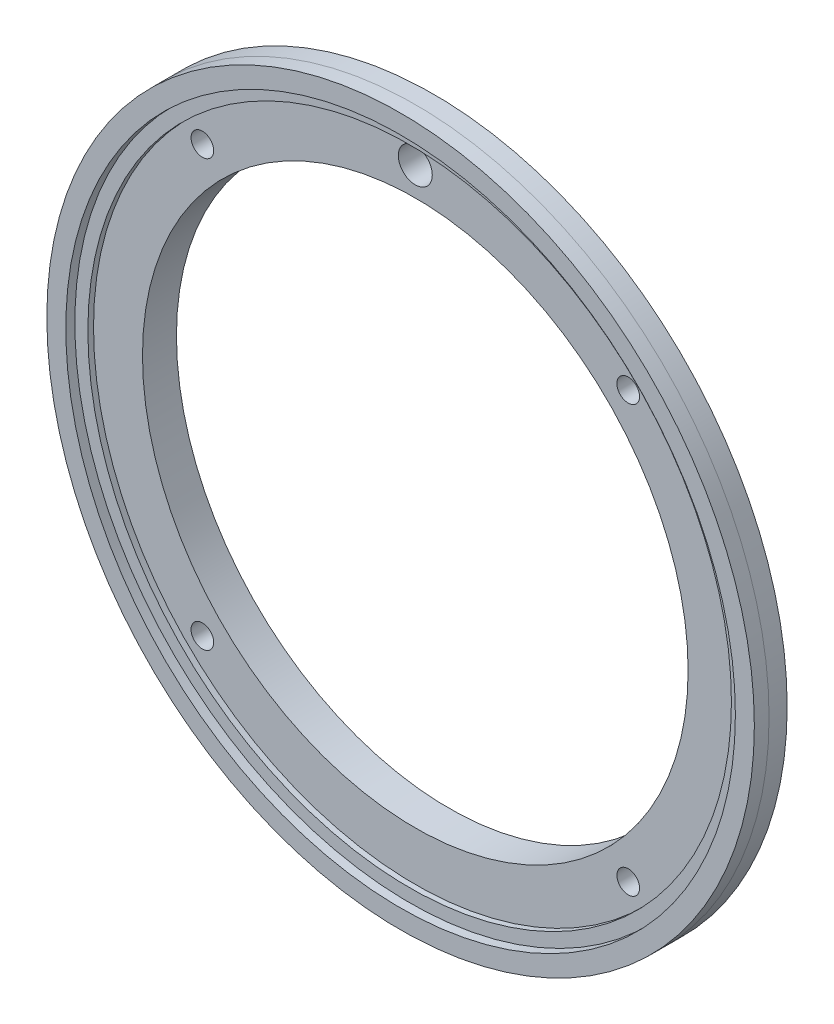
ISO-10303-21;
HEADER;
FILE_DESCRIPTION(('STEP AP214'),'2;1');
FILE_NAME('part.step','',(''),(''),'','','');
FILE_SCHEMA(('AUTOMOTIVE_DESIGN { 1 0 10303 214 1 1 1 1 }'));
ENDSEC;
DATA;
#1=APPLICATION_CONTEXT('core data for automotive mechanical design processes');
#2=APPLICATION_PROTOCOL_DEFINITION('international standard','automotive_design',2000,#1);
#3=PRODUCT_CONTEXT('',#1,'mechanical');
#4=PRODUCT('Part','Part','',(#3));
#5=PRODUCT_RELATED_PRODUCT_CATEGORY('part','',(#4));
#6=PRODUCT_DEFINITION_FORMATION('','',#4);
#7=PRODUCT_DEFINITION_CONTEXT('part definition',#1,'design');
#8=PRODUCT_DEFINITION('design','',#6,#7);
#9=PRODUCT_DEFINITION_SHAPE('','',#8);
#10=(LENGTH_UNIT() NAMED_UNIT(*) SI_UNIT(.MILLI.,.METRE.));
#11=(NAMED_UNIT(*) PLANE_ANGLE_UNIT() SI_UNIT($,.RADIAN.));
#12=(NAMED_UNIT(*) SI_UNIT($,.STERADIAN.) SOLID_ANGLE_UNIT());
#13=UNCERTAINTY_MEASURE_WITH_UNIT(LENGTH_MEASURE(1.E-05),#10,'distance_accuracy_value','');
#14=(GEOMETRIC_REPRESENTATION_CONTEXT(3) GLOBAL_UNCERTAINTY_ASSIGNED_CONTEXT((#13)) GLOBAL_UNIT_ASSIGNED_CONTEXT((#10,
#11,#12)) REPRESENTATION_CONTEXT('',''));
#15=CARTESIAN_POINT('',(0.,0.,0.));
#16=DIRECTION('',(0.,0.,1.));
#17=DIRECTION('',(1.,0.,0.));
#18=AXIS2_PLACEMENT_3D('',#15,#16,#17);
#19=CARTESIAN_POINT('',(28.425,0.,3.));
#20=DIRECTION('',(0.,0.,1.));
#21=DIRECTION('',(1.,0.,0.));
#22=AXIS2_PLACEMENT_3D('',#19,#20,#21);
#23=PLANE('',#22);
#24=CARTESIAN_POINT('',(0.,0.,3.));
#25=DIRECTION('',(0.,0.,1.));
#26=DIRECTION('',(1.,0.,0.));
#27=AXIS2_PLACEMENT_3D('',#24,#25,#26);
#28=CIRCLE('',#27,31.25);
#29=CARTESIAN_POINT('',(31.25,0.,3.));
#30=VERTEX_POINT('',#29);
#31=EDGE_CURVE('E49',#30,#30,#28,.T.);
#32=ORIENTED_EDGE('',*,*,#31,.T.);
#33=EDGE_LOOP('',(#32));
#34=FACE_BOUND('',#33,.T.);
#35=CARTESIAN_POINT('',(18.8090403795621,18.8090403795622,3.));
#36=DIRECTION('',(0.,0.,1.));
#37=DIRECTION('',(1.,0.,0.));
#38=AXIS2_PLACEMENT_3D('',#35,#36,#37);
#39=CIRCLE('',#38,1.00000000000013);
#40=CARTESIAN_POINT('',(17.809040379562,18.8090403795622,3.));
#41=VERTEX_POINT('',#40);
#42=EDGE_CURVE('E120',#41,#41,#39,.T.);
#43=ORIENTED_EDGE('',*,*,#42,.F.);
#44=EDGE_LOOP('',(#43));
#45=FACE_BOUND('',#44,.T.);
#46=CARTESIAN_POINT('',(18.8090403795622,-18.8090403795621,3.));
#47=DIRECTION('',(0.,0.,1.));
#48=DIRECTION('',(1.,0.,0.));
#49=AXIS2_PLACEMENT_3D('',#46,#47,#48);
#50=CIRCLE('',#49,1.00000000000009);
#51=CARTESIAN_POINT('',(17.8090403795621,-18.8090403795621,3.));
#52=VERTEX_POINT('',#51);
#53=EDGE_CURVE('E123',#52,#52,#50,.T.);
#54=ORIENTED_EDGE('',*,*,#53,.F.);
#55=EDGE_LOOP('',(#54));
#56=FACE_BOUND('',#55,.T.);
#57=CARTESIAN_POINT('',(-18.8090403795621,-18.8090403795622,3.));
#58=DIRECTION('',(0.,0.,1.));
#59=DIRECTION('',(1.,0.,0.));
#60=AXIS2_PLACEMENT_3D('',#57,#58,#59);
#61=CIRCLE('',#60,1.00000000000004);
#62=CARTESIAN_POINT('',(-19.8090403795622,-18.8090403795622,3.));
#63=VERTEX_POINT('',#62);
#64=EDGE_CURVE('E126',#63,#63,#61,.T.);
#65=ORIENTED_EDGE('',*,*,#64,.F.);
#66=EDGE_LOOP('',(#65));
#67=FACE_BOUND('',#66,.T.);
#68=CARTESIAN_POINT('',(0.,26.6,3.));
#69=DIRECTION('',(0.,0.,1.));
#70=DIRECTION('',(1.,0.,0.));
#71=AXIS2_PLACEMENT_3D('',#68,#69,#70);
#72=CIRCLE('',#71,1.5);
#73=CARTESIAN_POINT('',(1.5,26.6,3.));
#74=VERTEX_POINT('',#73);
#75=EDGE_CURVE('E129',#74,#74,#72,.T.);
#76=ORIENTED_EDGE('',*,*,#75,.F.);
#77=EDGE_LOOP('',(#76));
#78=FACE_BOUND('',#77,.T.);
#79=CARTESIAN_POINT('',(-18.8090403795622,18.8090403795621,3.));
#80=DIRECTION('',(0.,0.,1.));
#81=DIRECTION('',(1.,0.,0.));
#82=AXIS2_PLACEMENT_3D('',#79,#80,#81);
#83=CIRCLE('',#82,0.999999999999998);
#84=CARTESIAN_POINT('',(-19.8090403795622,18.8090403795621,3.));
#85=VERTEX_POINT('',#84);
#86=EDGE_CURVE('E132',#85,#85,#83,.T.);
#87=ORIENTED_EDGE('',*,*,#86,.F.);
#88=EDGE_LOOP('',(#87));
#89=FACE_BOUND('',#88,.T.);
#90=CARTESIAN_POINT('',(0.,0.,3.));
#91=DIRECTION('',(0.,0.,1.));
#92=DIRECTION('',(1.,0.,0.));
#93=AXIS2_PLACEMENT_3D('',#90,#91,#92);
#94=CIRCLE('',#93,24.1);
#95=CARTESIAN_POINT('',(24.1,0.,3.));
#96=VERTEX_POINT('',#95);
#97=EDGE_CURVE('E117',#96,#96,#94,.T.);
#98=ORIENTED_EDGE('',*,*,#97,.F.);
#99=EDGE_LOOP('',(#98));
#100=FACE_BOUND('',#99,.T.);
#101=ADVANCED_FACE('F45',(#34,#45,#56,#67,#78,#89,#100),#23,.T.);
#102=CARTESIAN_POINT('',(0.,0.,85.955757467538));
#103=DIRECTION('',(0.,0.,-1.));
#104=DIRECTION('',(-1.,0.,0.));
#105=AXIS2_PLACEMENT_3D('',#102,#103,#104);
#106=CYLINDRICAL_SURFACE('',#105,29.4);
#107=CARTESIAN_POINT('',(0.,0.,0.6));
#108=DIRECTION('',(0.,0.,1.));
#109=DIRECTION('',(1.,0.,0.));
#110=AXIS2_PLACEMENT_3D('',#107,#108,#109);
#111=CIRCLE('',#110,29.4);
#112=CARTESIAN_POINT('',(-29.4,0.,0.600000000000003));
#113=VERTEX_POINT('',#112);
#114=EDGE_CURVE('E109',#113,#113,#111,.T.);
#115=CARTESIAN_POINT('',(0.,0.,1.4));
#116=DIRECTION('',(0.,0.,1.));
#117=DIRECTION('',(1.,0.,0.));
#118=AXIS2_PLACEMENT_3D('',#115,#116,#117);
#119=CIRCLE('',#118,29.4);
#120=CARTESIAN_POINT('',(-29.4,0.,1.4));
#121=VERTEX_POINT('',#120);
#122=EDGE_CURVE('E105',#121,#121,#119,.T.);
#123=CARTESIAN_POINT('',(-29.4,0.,0.600000000000003));
#124=CARTESIAN_POINT('',(-29.4,0.,0.608333333333336));
#125=CARTESIAN_POINT('',(-29.4,0.,0.616666666666668));
#126=CARTESIAN_POINT('',(-29.4,0.,0.633333333333333));
#127=CARTESIAN_POINT('',(-29.4,0.,0.641666666666665));
#128=CARTESIAN_POINT('',(-29.4,0.,0.658333333333335));
#129=CARTESIAN_POINT('',(-29.4,0.,0.666666666666672));
#130=CARTESIAN_POINT('',(-29.4,0.,0.683333333333341));
#131=CARTESIAN_POINT('',(-29.4,0.,0.691666666666674));
#132=CARTESIAN_POINT('',(-29.4,0.,0.708333333333339));
#133=CARTESIAN_POINT('',(-29.4,0.,0.716666666666671));
#134=CARTESIAN_POINT('',(-29.4,0.,0.733333333333336));
#135=CARTESIAN_POINT('',(-29.4,0.,0.741666666666668));
#136=CARTESIAN_POINT('',(-29.4,0.,0.758333333333333));
#137=CARTESIAN_POINT('',(-29.4,0.,0.766666666666665));
#138=CARTESIAN_POINT('',(-29.4,0.,0.783333333333335));
#139=CARTESIAN_POINT('',(-29.4,0.,0.791666666666672));
#140=CARTESIAN_POINT('',(-29.4,0.,0.808333333333341));
#141=CARTESIAN_POINT('',(-29.4,0.,0.816666666666674));
#142=CARTESIAN_POINT('',(-29.4,0.,0.833333333333339));
#143=CARTESIAN_POINT('',(-29.4,0.,0.841666666666671));
#144=CARTESIAN_POINT('',(-29.4,0.,0.858333333333336));
#145=CARTESIAN_POINT('',(-29.4,0.,0.866666666666668));
#146=CARTESIAN_POINT('',(-29.4,0.,0.883333333333333));
#147=CARTESIAN_POINT('',(-29.4,0.,0.891666666666666));
#148=CARTESIAN_POINT('',(-29.4,0.,0.90833333333333));
#149=CARTESIAN_POINT('',(-29.4,0.,0.916666666666663));
#150=CARTESIAN_POINT('',(-29.4,0.,0.933333333333332));
#151=CARTESIAN_POINT('',(-29.4,0.,0.941666666666669));
#152=CARTESIAN_POINT('',(-29.4,0.,0.958333333333339));
#153=CARTESIAN_POINT('',(-29.4,0.,0.966666666666671));
#154=CARTESIAN_POINT('',(-29.4,0.,0.983333333333336));
#155=CARTESIAN_POINT('',(-29.4,0.,0.991666666666668));
#156=CARTESIAN_POINT('',(-29.4,0.,1.00833333333333));
#157=CARTESIAN_POINT('',(-29.4,0.,1.01666666666667));
#158=CARTESIAN_POINT('',(-29.4,0.,1.03333333333333));
#159=CARTESIAN_POINT('',(-29.4,0.,1.04166666666666));
#160=CARTESIAN_POINT('',(-29.4,0.,1.05833333333333));
#161=CARTESIAN_POINT('',(-29.4,0.,1.06666666666667));
#162=CARTESIAN_POINT('',(-29.4,0.,1.08333333333334));
#163=CARTESIAN_POINT('',(-29.4,0.,1.09166666666667));
#164=CARTESIAN_POINT('',(-29.4,0.,1.10833333333334));
#165=CARTESIAN_POINT('',(-29.4,0.,1.11666666666667));
#166=CARTESIAN_POINT('',(-29.4,0.,1.13333333333333));
#167=CARTESIAN_POINT('',(-29.4,0.,1.14166666666667));
#168=CARTESIAN_POINT('',(-29.4,0.,1.15833333333333));
#169=CARTESIAN_POINT('',(-29.4,0.,1.16666666666666));
#170=CARTESIAN_POINT('',(-29.4,0.,1.18333333333333));
#171=CARTESIAN_POINT('',(-29.4,0.,1.19166666666666));
#172=CARTESIAN_POINT('',(-29.4,0.,1.20833333333333));
#173=CARTESIAN_POINT('',(-29.4,0.,1.21666666666667));
#174=CARTESIAN_POINT('',(-29.4,0.,1.23333333333334));
#175=CARTESIAN_POINT('',(-29.4,0.,1.24166666666667));
#176=CARTESIAN_POINT('',(-29.4,0.,1.25833333333333));
#177=CARTESIAN_POINT('',(-29.4,0.,1.26666666666667));
#178=CARTESIAN_POINT('',(-29.4,0.,1.28333333333333));
#179=CARTESIAN_POINT('',(-29.4,0.,1.29166666666666));
#180=CARTESIAN_POINT('',(-29.4,0.,1.30833333333333));
#181=CARTESIAN_POINT('',(-29.4,0.,1.31666666666666));
#182=CARTESIAN_POINT('',(-29.4,0.,1.33333333333333));
#183=CARTESIAN_POINT('',(-29.4,0.,1.34166666666667));
#184=CARTESIAN_POINT('',(-29.4,0.,1.35833333333334));
#185=CARTESIAN_POINT('',(-29.4,0.,1.36666666666667));
#186=CARTESIAN_POINT('',(-29.4,0.,1.38333333333333));
#187=CARTESIAN_POINT('',(-29.4,0.,1.39166666666667));
#188=CARTESIAN_POINT('',(-29.4,0.,1.4));
#189=B_SPLINE_CURVE_WITH_KNOTS('',3,(#123,#124,#125,#126,#127,#128,#129,#130,#131,#132,#133,
#134,#135,#136,#137,#138,#139,#140,#141,#142,#143,#144,#145,#146,#147,#148,#149,#150,#151,#152,
#153,#154,#155,#156,#157,#158,#159,#160,#161,#162,#163,#164,#165,#166,#167,#168,#169,#170,#171,
#172,#173,#174,#175,#176,#177,#178,#179,#180,#181,#182,#183,#184,#185,#186,#187,#188),
.UNSPECIFIED.,.F.,.F.,(4,2,2,2,2,2,2,2,2,2,2,2,2,2,2,2,2,2,2,2,2,2,2,2,2,2,2,2,2,2,2,2,4),(0.,
0.0249999999999972,0.0499999999999945,0.0750000000000056,0.100000000000003,0.125,
0.149999999999997,0.174999999999995,0.200000000000006,0.225000000000003,0.25,0.274999999999997,
0.299999999999995,0.324999999999992,0.350000000000003,0.375,0.399999999999998,0.424999999999995,
0.449999999999992,0.475000000000003,0.5,0.524999999999998,0.549999999999995,0.574999999999992,
0.599999999999989,0.625000000000001,0.649999999999998,0.674999999999995,0.699999999999992,
0.72499999999999,0.750000000000001,0.774999999999998,0.799999999999995),.UNSPECIFIED.);
#190=EDGE_CURVE('BSEAM172',#113,#121,#189,.T.);
#191=ORIENTED_EDGE('',*,*,#114,.T.);
#192=ORIENTED_EDGE('',*,*,#122,.F.);
#193=ORIENTED_EDGE('',*,*,#190,.T.);
#194=ORIENTED_EDGE('',*,*,#190,.F.);
#195=EDGE_LOOP('',(#191,#193,#192,#194));
#196=FACE_BOUND('',#195,.T.);
#197=ADVANCED_FACE('F172',(#196),#106,.T.);
#198=CARTESIAN_POINT('',(0.,0.,0.6));
#199=DIRECTION('',(0.,0.,-1.));
#200=DIRECTION('',(-1.,0.,0.));
#201=AXIS2_PLACEMENT_3D('',#198,#199,#200);
#202=CYLINDRICAL_SURFACE('',#201,28.3);
#203=CARTESIAN_POINT('',(0.,0.,0.6));
#204=DIRECTION('',(0.,0.,1.));
#205=DIRECTION('',(1.,0.,0.));
#206=AXIS2_PLACEMENT_3D('',#203,#204,#205);
#207=CIRCLE('',#206,28.3);
#208=CARTESIAN_POINT('',(-1.5,28.2602193905143,0.6));
#209=VERTEX_POINT('',#208);
#210=CARTESIAN_POINT('',(1.5,28.2602193905143,0.6));
#211=VERTEX_POINT('',#210);
#212=EDGE_CURVE('E102',#209,#211,#207,.T.);
#213=ORIENTED_EDGE('',*,*,#212,.F.);
#214=DIRECTION('',(0.,0.,-1.));
#215=VECTOR('',#214,1.);
#216=CARTESIAN_POINT('',(-1.5,28.2602193905143,4.04818792991333));
#217=LINE('',#216,#215);
#218=CARTESIAN_POINT('',(-1.5,28.2602193905143,0.));
#219=VERTEX_POINT('',#218);
#220=EDGE_CURVE('E86',#209,#219,#217,.T.);
#221=ORIENTED_EDGE('',*,*,#220,.T.);
#222=CARTESIAN_POINT('',(0.,0.,0.));
#223=DIRECTION('',(0.,0.,1.));
#224=DIRECTION('',(1.,0.,0.));
#225=AXIS2_PLACEMENT_3D('',#222,#223,#224);
#226=CIRCLE('',#225,28.3);
#227=CARTESIAN_POINT('',(1.5,28.2602193905143,0.));
#228=VERTEX_POINT('',#227);
#229=EDGE_CURVE('E94',#219,#228,#226,.T.);
#230=ORIENTED_EDGE('',*,*,#229,.T.);
#231=DIRECTION('',(0.,0.,-1.));
#232=VECTOR('',#231,1.);
#233=CARTESIAN_POINT('',(1.5,28.2602193905143,4.04818792991333));
#234=LINE('',#233,#232);
#235=EDGE_CURVE('E78',#211,#228,#234,.T.);
#236=ORIENTED_EDGE('',*,*,#235,.F.);
#237=EDGE_LOOP('',(#213,#221,#230,#236));
#238=FACE_BOUND('',#237,.T.);
#239=ADVANCED_FACE('F99',(#238),#202,.T.);
#240=CARTESIAN_POINT('',(1.5,0.,4.04818792991333));
#241=DIRECTION('',(-1.,0.,0.));
#242=DIRECTION('',(0.,0.,1.));
#243=AXIS2_PLACEMENT_3D('',#240,#241,#242);
#244=PLANE('',#243);
#245=DIRECTION('',(0.,1.,0.));
#246=VECTOR('',#245,1.);
#247=CARTESIAN_POINT('',(1.5,0.,0.6));
#248=LINE('',#247,#246);
#249=CARTESIAN_POINT('',(1.5,26.6,0.6));
#250=VERTEX_POINT('',#249);
#251=EDGE_CURVE('E12',#250,#211,#248,.T.);
#252=ORIENTED_EDGE('',*,*,#251,.T.);
#253=ORIENTED_EDGE('',*,*,#235,.T.);
#254=DIRECTION('',(0.,1.,0.));
#255=VECTOR('',#254,1.);
#256=CARTESIAN_POINT('',(1.5,0.,0.));
#257=LINE('',#256,#255);
#258=CARTESIAN_POINT('',(1.5,26.6,0.));
#259=VERTEX_POINT('',#258);
#260=EDGE_CURVE('E81',#259,#228,#257,.T.);
#261=ORIENTED_EDGE('',*,*,#260,.F.);
#262=DIRECTION('',(0.,0.,-1.));
#263=VECTOR('',#262,1.);
#264=CARTESIAN_POINT('',(1.5,26.6,4.04818792991333));
#265=LINE('',#264,#263);
#266=EDGE_CURVE('E63',#250,#259,#265,.T.);
#267=ORIENTED_EDGE('',*,*,#266,.F.);
#268=EDGE_LOOP('',(#252,#253,#261,#267));
#269=FACE_BOUND('',#268,.T.);
#270=ADVANCED_FACE('F80',(#269),#244,.T.);
#271=CARTESIAN_POINT('',(0.,0.,0.6));
#272=DIRECTION('',(0.,0.,1.));
#273=DIRECTION('',(1.,0.,0.));
#274=AXIS2_PLACEMENT_3D('',#271,#272,#273);
#275=PLANE('',#274);
#276=ORIENTED_EDGE('',*,*,#212,.T.);
#277=ORIENTED_EDGE('',*,*,#251,.F.);
#278=CARTESIAN_POINT('',(0.,26.6,0.6));
#279=DIRECTION('',(0.,0.,1.));
#280=DIRECTION('',(1.,0.,0.));
#281=AXIS2_PLACEMENT_3D('',#278,#279,#280);
#282=CIRCLE('',#281,1.5);
#283=CARTESIAN_POINT('',(-1.5,26.6,0.6));
#284=VERTEX_POINT('',#283);
#285=EDGE_CURVE('E97',#250,#284,#282,.T.);
#286=ORIENTED_EDGE('',*,*,#285,.T.);
#287=DIRECTION('',(0.,1.,0.));
#288=VECTOR('',#287,1.);
#289=CARTESIAN_POINT('',(-1.5,0.,0.6));
#290=LINE('',#289,#288);
#291=EDGE_CURVE('E150',#284,#209,#290,.T.);
#292=ORIENTED_EDGE('',*,*,#291,.T.);
#293=EDGE_LOOP('',(#276,#277,#286,#292));
#294=FACE_BOUND('',#293,.T.);
#295=ORIENTED_EDGE('',*,*,#114,.F.);
#296=EDGE_LOOP('',(#295));
#297=FACE_BOUND('',#296,.T.);
#298=ADVANCED_FACE('F166',(#294,#297),#275,.F.);
#299=CARTESIAN_POINT('',(-1.5,0.,4.04818792991333));
#300=DIRECTION('',(-1.,0.,0.));
#301=DIRECTION('',(0.,0.,1.));
#302=AXIS2_PLACEMENT_3D('',#299,#300,#301);
#303=PLANE('',#302);
#304=DIRECTION('',(0.,0.,-1.));
#305=VECTOR('',#304,1.);
#306=CARTESIAN_POINT('',(-1.5,26.6,4.04818792991333));
#307=LINE('',#306,#305);
#308=CARTESIAN_POINT('',(-1.5,26.6,0.));
#309=VERTEX_POINT('',#308);
#310=EDGE_CURVE('E141',#284,#309,#307,.T.);
#311=ORIENTED_EDGE('',*,*,#310,.T.);
#312=DIRECTION('',(0.,1.,0.));
#313=VECTOR('',#312,1.);
#314=CARTESIAN_POINT('',(-1.5,0.,0.));
#315=LINE('',#314,#313);
#316=EDGE_CURVE('E55',#309,#219,#315,.T.);
#317=ORIENTED_EDGE('',*,*,#316,.T.);
#318=ORIENTED_EDGE('',*,*,#220,.F.);
#319=ORIENTED_EDGE('',*,*,#291,.F.);
#320=EDGE_LOOP('',(#311,#317,#318,#319));
#321=FACE_BOUND('',#320,.T.);
#322=ADVANCED_FACE('F158',(#321),#303,.F.);
#323=CARTESIAN_POINT('',(0.,0.,0.));
#324=DIRECTION('',(0.,0.,1.));
#325=DIRECTION('',(1.,0.,0.));
#326=AXIS2_PLACEMENT_3D('',#323,#324,#325);
#327=PLANE('',#326);
#328=CARTESIAN_POINT('',(18.8090403795621,18.8090403795622,0.));
#329=DIRECTION('',(0.,0.,-1.));
#330=DIRECTION('',(-1.,0.,0.));
#331=AXIS2_PLACEMENT_3D('',#328,#329,#330);
#332=CIRCLE('',#331,1.00000000000013);
#333=CARTESIAN_POINT('',(17.809040379562,18.8090403795622,0.));
#334=VERTEX_POINT('',#333);
#335=EDGE_CURVE('E138',#334,#334,#332,.T.);
#336=ORIENTED_EDGE('',*,*,#335,.F.);
#337=EDGE_LOOP('',(#336));
#338=FACE_BOUND('',#337,.T.);
#339=CARTESIAN_POINT('',(18.8090403795622,-18.8090403795621,0.));
#340=DIRECTION('',(0.,0.,-1.));
#341=DIRECTION('',(-1.,0.,0.));
#342=AXIS2_PLACEMENT_3D('',#339,#340,#341);
#343=CIRCLE('',#342,1.00000000000009);
#344=CARTESIAN_POINT('',(17.8090403795621,-18.8090403795621,0.));
#345=VERTEX_POINT('',#344);
#346=EDGE_CURVE('E142',#345,#345,#343,.T.);
#347=ORIENTED_EDGE('',*,*,#346,.F.);
#348=EDGE_LOOP('',(#347));
#349=FACE_BOUND('',#348,.T.);
#350=CARTESIAN_POINT('',(-18.8090403795621,-18.8090403795622,0.));
#351=DIRECTION('',(0.,0.,-1.));
#352=DIRECTION('',(-1.,0.,0.));
#353=AXIS2_PLACEMENT_3D('',#350,#351,#352);
#354=CIRCLE('',#353,1.00000000000004);
#355=CARTESIAN_POINT('',(-19.8090403795622,-18.8090403795622,0.));
#356=VERTEX_POINT('',#355);
#357=EDGE_CURVE('E145',#356,#356,#354,.T.);
#358=ORIENTED_EDGE('',*,*,#357,.F.);
#359=EDGE_LOOP('',(#358));
#360=FACE_BOUND('',#359,.T.);
#361=CARTESIAN_POINT('',(-18.8090403795622,18.8090403795621,0.));
#362=DIRECTION('',(0.,0.,-1.));
#363=DIRECTION('',(-1.,0.,0.));
#364=AXIS2_PLACEMENT_3D('',#361,#362,#363);
#365=CIRCLE('',#364,0.999999999999998);
#366=CARTESIAN_POINT('',(-19.8090403795622,18.8090403795621,0.));
#367=VERTEX_POINT('',#366);
#368=EDGE_CURVE('E135',#367,#367,#365,.T.);
#369=ORIENTED_EDGE('',*,*,#368,.F.);
#370=EDGE_LOOP('',(#369));
#371=FACE_BOUND('',#370,.T.);
#372=ORIENTED_EDGE('',*,*,#229,.F.);
#373=ORIENTED_EDGE('',*,*,#316,.F.);
#374=CARTESIAN_POINT('',(0.,26.6,0.));
#375=DIRECTION('',(0.,0.,-1.));
#376=DIRECTION('',(-1.,0.,0.));
#377=AXIS2_PLACEMENT_3D('',#374,#375,#376);
#378=CIRCLE('',#377,1.5);
#379=EDGE_CURVE('E96',#259,#309,#378,.T.);
#380=ORIENTED_EDGE('',*,*,#379,.F.);
#381=ORIENTED_EDGE('',*,*,#260,.T.);
#382=EDGE_LOOP('',(#372,#373,#380,#381));
#383=FACE_BOUND('',#382,.T.);
#384=CARTESIAN_POINT('',(0.,0.,0.));
#385=DIRECTION('',(0.,0.,1.));
#386=DIRECTION('',(1.,0.,0.));
#387=AXIS2_PLACEMENT_3D('',#384,#385,#386);
#388=CIRCLE('',#387,24.1);
#389=CARTESIAN_POINT('',(24.1,0.,0.));
#390=VERTEX_POINT('',#389);
#391=EDGE_CURVE('E101',#390,#390,#388,.T.);
#392=ORIENTED_EDGE('',*,*,#391,.T.);
#393=EDGE_LOOP('',(#392));
#394=FACE_BOUND('',#393,.T.);
#395=ADVANCED_FACE('F91',(#338,#349,#360,#371,#383,#394),#327,.F.);
#396=CARTESIAN_POINT('',(18.8090403795621,18.8090403795622,4.3));
#397=DIRECTION('',(0.,0.,-1.));
#398=DIRECTION('',(-1.,0.,0.));
#399=AXIS2_PLACEMENT_3D('',#396,#397,#398);
#400=CYLINDRICAL_SURFACE('',#399,1.00000000000013);
#401=CARTESIAN_POINT('',(17.809040379562,18.8090403795622,3.));
#402=CARTESIAN_POINT('',(17.809040379562,18.8090403795622,2.96875));
#403=CARTESIAN_POINT('',(17.809040379562,18.8090403795622,2.9375));
#404=CARTESIAN_POINT('',(17.809040379562,18.8090403795622,2.875));
#405=CARTESIAN_POINT('',(17.809040379562,18.8090403795622,2.84375));
#406=CARTESIAN_POINT('',(17.809040379562,18.8090403795622,2.78125));
#407=CARTESIAN_POINT('',(17.809040379562,18.8090403795622,2.75));
#408=CARTESIAN_POINT('',(17.809040379562,18.8090403795622,2.6875));
#409=CARTESIAN_POINT('',(17.809040379562,18.8090403795622,2.65625));
#410=CARTESIAN_POINT('',(17.809040379562,18.8090403795622,2.59375));
#411=CARTESIAN_POINT('',(17.809040379562,18.8090403795622,2.5625));
#412=CARTESIAN_POINT('',(17.809040379562,18.8090403795622,2.5));
#413=CARTESIAN_POINT('',(17.809040379562,18.8090403795622,2.46875));
#414=CARTESIAN_POINT('',(17.809040379562,18.8090403795622,2.40625));
#415=CARTESIAN_POINT('',(17.809040379562,18.8090403795622,2.375));
#416=CARTESIAN_POINT('',(17.809040379562,18.8090403795622,2.3125));
#417=CARTESIAN_POINT('',(17.809040379562,18.8090403795622,2.28125));
#418=CARTESIAN_POINT('',(17.809040379562,18.8090403795622,2.21875));
#419=CARTESIAN_POINT('',(17.809040379562,18.8090403795622,2.1875));
#420=CARTESIAN_POINT('',(17.809040379562,18.8090403795622,2.125));
#421=CARTESIAN_POINT('',(17.809040379562,18.8090403795622,2.09375));
#422=CARTESIAN_POINT('',(17.809040379562,18.8090403795622,2.03125));
#423=CARTESIAN_POINT('',(17.809040379562,18.8090403795622,2.));
#424=CARTESIAN_POINT('',(17.809040379562,18.8090403795622,1.9375));
#425=CARTESIAN_POINT('',(17.809040379562,18.8090403795622,1.90625));
#426=CARTESIAN_POINT('',(17.809040379562,18.8090403795622,1.84375));
#427=CARTESIAN_POINT('',(17.809040379562,18.8090403795622,1.8125));
#428=CARTESIAN_POINT('',(17.809040379562,18.8090403795622,1.75));
#429=CARTESIAN_POINT('',(17.809040379562,18.8090403795622,1.71875));
#430=CARTESIAN_POINT('',(17.809040379562,18.8090403795622,1.65625));
#431=CARTESIAN_POINT('',(17.809040379562,18.8090403795622,1.625));
#432=CARTESIAN_POINT('',(17.809040379562,18.8090403795622,1.5625));
#433=CARTESIAN_POINT('',(17.809040379562,18.8090403795622,1.53125));
#434=CARTESIAN_POINT('',(17.809040379562,18.8090403795622,1.46875));
#435=CARTESIAN_POINT('',(17.809040379562,18.8090403795622,1.4375));
#436=CARTESIAN_POINT('',(17.809040379562,18.8090403795622,1.375));
#437=CARTESIAN_POINT('',(17.809040379562,18.8090403795622,1.34375));
#438=CARTESIAN_POINT('',(17.809040379562,18.8090403795622,1.28125));
#439=CARTESIAN_POINT('',(17.809040379562,18.8090403795622,1.25));
#440=CARTESIAN_POINT('',(17.809040379562,18.8090403795622,1.1875));
#441=CARTESIAN_POINT('',(17.809040379562,18.8090403795622,1.15625));
#442=CARTESIAN_POINT('',(17.809040379562,18.8090403795622,1.09375));
#443=CARTESIAN_POINT('',(17.809040379562,18.8090403795622,1.0625));
#444=CARTESIAN_POINT('',(17.809040379562,18.8090403795622,1.));
#445=CARTESIAN_POINT('',(17.809040379562,18.8090403795622,0.96875));
#446=CARTESIAN_POINT('',(17.809040379562,18.8090403795622,0.90625));
#447=CARTESIAN_POINT('',(17.809040379562,18.8090403795622,0.875));
#448=CARTESIAN_POINT('',(17.809040379562,18.8090403795622,0.8125));
#449=CARTESIAN_POINT('',(17.809040379562,18.8090403795622,0.78125));
#450=CARTESIAN_POINT('',(17.809040379562,18.8090403795622,0.71875));
#451=CARTESIAN_POINT('',(17.809040379562,18.8090403795622,0.6875));
#452=CARTESIAN_POINT('',(17.809040379562,18.8090403795622,0.625));
#453=CARTESIAN_POINT('',(17.809040379562,18.8090403795622,0.59375));
#454=CARTESIAN_POINT('',(17.809040379562,18.8090403795622,0.53125));
#455=CARTESIAN_POINT('',(17.809040379562,18.8090403795622,0.5));
#456=CARTESIAN_POINT('',(17.809040379562,18.8090403795622,0.437500000000001));
#457=CARTESIAN_POINT('',(17.809040379562,18.8090403795622,0.406250000000001));
#458=CARTESIAN_POINT('',(17.809040379562,18.8090403795622,0.343750000000001));
#459=CARTESIAN_POINT('',(17.809040379562,18.8090403795622,0.312500000000001));
#460=CARTESIAN_POINT('',(17.809040379562,18.8090403795622,0.250000000000001));
#461=CARTESIAN_POINT('',(17.809040379562,18.8090403795622,0.218750000000001));
#462=CARTESIAN_POINT('',(17.809040379562,18.8090403795622,0.156250000000001));
#463=CARTESIAN_POINT('',(17.809040379562,18.8090403795622,0.125000000000001));
#464=CARTESIAN_POINT('',(17.809040379562,18.8090403795622,0.0625000000000009));
#465=CARTESIAN_POINT('',(17.809040379562,18.8090403795622,0.0312500000000009));
#466=CARTESIAN_POINT('',(17.809040379562,18.8090403795622,0.));
#467=B_SPLINE_CURVE_WITH_KNOTS('',3,(#401,#402,#403,#404,#405,#406,#407,#408,#409,#410,#411,
#412,#413,#414,#415,#416,#417,#418,#419,#420,#421,#422,#423,#424,#425,#426,#427,#428,#429,#430,
#431,#432,#433,#434,#435,#436,#437,#438,#439,#440,#441,#442,#443,#444,#445,#446,#447,#448,#449,
#450,#451,#452,#453,#454,#455,#456,#457,#458,#459,#460,#461,#462,#463,#464,#465,#466),
.UNSPECIFIED.,.F.,.F.,(4,2,2,2,2,2,2,2,2,2,2,2,2,2,2,2,2,2,2,2,2,2,2,2,2,2,2,2,2,2,2,2,4),(0.,
0.0937500000000001,0.1875,0.28125,0.375,0.46875,0.5625,0.65625,0.75,0.84375,0.9375,1.03125,
1.125,1.21875,1.3125,1.40625,1.5,1.59375,1.6875,1.78125,1.875,1.96875,2.0625,2.15625,2.25,
2.34375,2.4375,2.53125,2.625,2.71875,2.8125,2.90625,3.),.UNSPECIFIED.);
#468=EDGE_CURVE('BSEAM217',#41,#334,#467,.T.);
#469=ORIENTED_EDGE('',*,*,#42,.T.);
#470=ORIENTED_EDGE('',*,*,#335,.T.);
#471=ORIENTED_EDGE('',*,*,#468,.T.);
#472=ORIENTED_EDGE('',*,*,#468,.F.);
#473=EDGE_LOOP('',(#469,#471,#470,#472));
#474=FACE_BOUND('',#473,.T.);
#475=ADVANCED_FACE('F217',(#474),#400,.F.);
#476=CARTESIAN_POINT('',(18.8090403795622,-18.8090403795621,4.3));
#477=DIRECTION('',(0.,0.,-1.));
#478=DIRECTION('',(-1.,0.,0.));
#479=AXIS2_PLACEMENT_3D('',#476,#477,#478);
#480=CYLINDRICAL_SURFACE('',#479,1.00000000000009);
#481=CARTESIAN_POINT('',(17.8090403795621,-18.8090403795621,3.));
#482=CARTESIAN_POINT('',(17.8090403795621,-18.8090403795621,2.96875));
#483=CARTESIAN_POINT('',(17.8090403795621,-18.8090403795621,2.9375));
#484=CARTESIAN_POINT('',(17.8090403795621,-18.8090403795621,2.875));
#485=CARTESIAN_POINT('',(17.8090403795621,-18.8090403795621,2.84375));
#486=CARTESIAN_POINT('',(17.8090403795621,-18.8090403795621,2.78125));
#487=CARTESIAN_POINT('',(17.8090403795621,-18.8090403795621,2.75));
#488=CARTESIAN_POINT('',(17.8090403795621,-18.8090403795621,2.6875));
#489=CARTESIAN_POINT('',(17.8090403795621,-18.8090403795621,2.65625));
#490=CARTESIAN_POINT('',(17.8090403795621,-18.8090403795621,2.59375));
#491=CARTESIAN_POINT('',(17.8090403795621,-18.8090403795621,2.5625));
#492=CARTESIAN_POINT('',(17.8090403795621,-18.8090403795621,2.5));
#493=CARTESIAN_POINT('',(17.8090403795621,-18.8090403795621,2.46875));
#494=CARTESIAN_POINT('',(17.8090403795621,-18.8090403795621,2.40625));
#495=CARTESIAN_POINT('',(17.8090403795621,-18.8090403795621,2.375));
#496=CARTESIAN_POINT('',(17.8090403795621,-18.8090403795621,2.3125));
#497=CARTESIAN_POINT('',(17.8090403795621,-18.8090403795621,2.28125));
#498=CARTESIAN_POINT('',(17.8090403795621,-18.8090403795621,2.21875));
#499=CARTESIAN_POINT('',(17.8090403795621,-18.8090403795621,2.1875));
#500=CARTESIAN_POINT('',(17.8090403795621,-18.8090403795621,2.125));
#501=CARTESIAN_POINT('',(17.8090403795621,-18.8090403795621,2.09375));
#502=CARTESIAN_POINT('',(17.8090403795621,-18.8090403795621,2.03125));
#503=CARTESIAN_POINT('',(17.8090403795621,-18.8090403795621,2.));
#504=CARTESIAN_POINT('',(17.8090403795621,-18.8090403795621,1.9375));
#505=CARTESIAN_POINT('',(17.8090403795621,-18.8090403795621,1.90625));
#506=CARTESIAN_POINT('',(17.8090403795621,-18.8090403795621,1.84375));
#507=CARTESIAN_POINT('',(17.8090403795621,-18.8090403795621,1.8125));
#508=CARTESIAN_POINT('',(17.8090403795621,-18.8090403795621,1.75));
#509=CARTESIAN_POINT('',(17.8090403795621,-18.8090403795621,1.71875));
#510=CARTESIAN_POINT('',(17.8090403795621,-18.8090403795621,1.65625));
#511=CARTESIAN_POINT('',(17.8090403795621,-18.8090403795621,1.625));
#512=CARTESIAN_POINT('',(17.8090403795621,-18.8090403795621,1.5625));
#513=CARTESIAN_POINT('',(17.8090403795621,-18.8090403795621,1.53125));
#514=CARTESIAN_POINT('',(17.8090403795621,-18.8090403795621,1.46875));
#515=CARTESIAN_POINT('',(17.8090403795621,-18.8090403795621,1.4375));
#516=CARTESIAN_POINT('',(17.8090403795621,-18.8090403795621,1.375));
#517=CARTESIAN_POINT('',(17.8090403795621,-18.8090403795621,1.34375));
#518=CARTESIAN_POINT('',(17.8090403795621,-18.8090403795621,1.28125));
#519=CARTESIAN_POINT('',(17.8090403795621,-18.8090403795621,1.25));
#520=CARTESIAN_POINT('',(17.8090403795621,-18.8090403795621,1.1875));
#521=CARTESIAN_POINT('',(17.8090403795621,-18.8090403795621,1.15625));
#522=CARTESIAN_POINT('',(17.8090403795621,-18.8090403795621,1.09375));
#523=CARTESIAN_POINT('',(17.8090403795621,-18.8090403795621,1.0625));
#524=CARTESIAN_POINT('',(17.8090403795621,-18.8090403795621,1.));
#525=CARTESIAN_POINT('',(17.8090403795621,-18.8090403795621,0.96875));
#526=CARTESIAN_POINT('',(17.8090403795621,-18.8090403795621,0.90625));
#527=CARTESIAN_POINT('',(17.8090403795621,-18.8090403795621,0.875));
#528=CARTESIAN_POINT('',(17.8090403795621,-18.8090403795621,0.8125));
#529=CARTESIAN_POINT('',(17.8090403795621,-18.8090403795621,0.78125));
#530=CARTESIAN_POINT('',(17.8090403795621,-18.8090403795621,0.71875));
#531=CARTESIAN_POINT('',(17.8090403795621,-18.8090403795621,0.6875));
#532=CARTESIAN_POINT('',(17.8090403795621,-18.8090403795621,0.625));
#533=CARTESIAN_POINT('',(17.8090403795621,-18.8090403795621,0.59375));
#534=CARTESIAN_POINT('',(17.8090403795621,-18.8090403795621,0.53125));
#535=CARTESIAN_POINT('',(17.8090403795621,-18.8090403795621,0.5));
#536=CARTESIAN_POINT('',(17.8090403795621,-18.8090403795621,0.437500000000001));
#537=CARTESIAN_POINT('',(17.8090403795621,-18.8090403795621,0.406250000000001));
#538=CARTESIAN_POINT('',(17.8090403795621,-18.8090403795621,0.343750000000001));
#539=CARTESIAN_POINT('',(17.8090403795621,-18.8090403795621,0.312500000000001));
#540=CARTESIAN_POINT('',(17.8090403795621,-18.8090403795621,0.250000000000001));
#541=CARTESIAN_POINT('',(17.8090403795621,-18.8090403795621,0.218750000000001));
#542=CARTESIAN_POINT('',(17.8090403795621,-18.8090403795621,0.156250000000001));
#543=CARTESIAN_POINT('',(17.8090403795621,-18.8090403795621,0.125000000000001));
#544=CARTESIAN_POINT('',(17.8090403795621,-18.8090403795621,0.0625000000000009));
#545=CARTESIAN_POINT('',(17.8090403795621,-18.8090403795621,0.0312500000000009));
#546=CARTESIAN_POINT('',(17.8090403795621,-18.8090403795621,0.));
#547=B_SPLINE_CURVE_WITH_KNOTS('',3,(#481,#482,#483,#484,#485,#486,#487,#488,#489,#490,#491,
#492,#493,#494,#495,#496,#497,#498,#499,#500,#501,#502,#503,#504,#505,#506,#507,#508,#509,#510,
#511,#512,#513,#514,#515,#516,#517,#518,#519,#520,#521,#522,#523,#524,#525,#526,#527,#528,#529,
#530,#531,#532,#533,#534,#535,#536,#537,#538,#539,#540,#541,#542,#543,#544,#545,#546),
.UNSPECIFIED.,.F.,.F.,(4,2,2,2,2,2,2,2,2,2,2,2,2,2,2,2,2,2,2,2,2,2,2,2,2,2,2,2,2,2,2,2,4),(0.,
0.0937500000000001,0.1875,0.28125,0.375,0.46875,0.5625,0.65625,0.75,0.84375,0.9375,1.03125,
1.125,1.21875,1.3125,1.40625,1.5,1.59375,1.6875,1.78125,1.875,1.96875,2.0625,2.15625,2.25,
2.34375,2.4375,2.53125,2.625,2.71875,2.8125,2.90625,3.),.UNSPECIFIED.);
#548=EDGE_CURVE('BSEAM220',#52,#345,#547,.T.);
#549=ORIENTED_EDGE('',*,*,#53,.T.);
#550=ORIENTED_EDGE('',*,*,#346,.T.);
#551=ORIENTED_EDGE('',*,*,#548,.T.);
#552=ORIENTED_EDGE('',*,*,#548,.F.);
#553=EDGE_LOOP('',(#549,#551,#550,#552));
#554=FACE_BOUND('',#553,.T.);
#555=ADVANCED_FACE('F220',(#554),#480,.F.);
#556=CARTESIAN_POINT('',(-18.8090403795621,-18.8090403795622,4.3));
#557=DIRECTION('',(0.,0.,-1.));
#558=DIRECTION('',(-1.,0.,0.));
#559=AXIS2_PLACEMENT_3D('',#556,#557,#558);
#560=CYLINDRICAL_SURFACE('',#559,1.00000000000004);
#561=CARTESIAN_POINT('',(-19.8090403795622,-18.8090403795622,3.));
#562=CARTESIAN_POINT('',(-19.8090403795622,-18.8090403795622,2.96875));
#563=CARTESIAN_POINT('',(-19.8090403795622,-18.8090403795622,2.9375));
#564=CARTESIAN_POINT('',(-19.8090403795622,-18.8090403795622,2.875));
#565=CARTESIAN_POINT('',(-19.8090403795622,-18.8090403795622,2.84375));
#566=CARTESIAN_POINT('',(-19.8090403795622,-18.8090403795622,2.78125));
#567=CARTESIAN_POINT('',(-19.8090403795622,-18.8090403795622,2.75));
#568=CARTESIAN_POINT('',(-19.8090403795622,-18.8090403795622,2.6875));
#569=CARTESIAN_POINT('',(-19.8090403795622,-18.8090403795622,2.65625));
#570=CARTESIAN_POINT('',(-19.8090403795622,-18.8090403795622,2.59375));
#571=CARTESIAN_POINT('',(-19.8090403795622,-18.8090403795622,2.5625));
#572=CARTESIAN_POINT('',(-19.8090403795622,-18.8090403795622,2.5));
#573=CARTESIAN_POINT('',(-19.8090403795622,-18.8090403795622,2.46875));
#574=CARTESIAN_POINT('',(-19.8090403795622,-18.8090403795622,2.40625));
#575=CARTESIAN_POINT('',(-19.8090403795622,-18.8090403795622,2.375));
#576=CARTESIAN_POINT('',(-19.8090403795622,-18.8090403795622,2.3125));
#577=CARTESIAN_POINT('',(-19.8090403795622,-18.8090403795622,2.28125));
#578=CARTESIAN_POINT('',(-19.8090403795622,-18.8090403795622,2.21875));
#579=CARTESIAN_POINT('',(-19.8090403795622,-18.8090403795622,2.1875));
#580=CARTESIAN_POINT('',(-19.8090403795622,-18.8090403795622,2.125));
#581=CARTESIAN_POINT('',(-19.8090403795622,-18.8090403795622,2.09375));
#582=CARTESIAN_POINT('',(-19.8090403795622,-18.8090403795622,2.03125));
#583=CARTESIAN_POINT('',(-19.8090403795622,-18.8090403795622,2.));
#584=CARTESIAN_POINT('',(-19.8090403795622,-18.8090403795622,1.9375));
#585=CARTESIAN_POINT('',(-19.8090403795622,-18.8090403795622,1.90625));
#586=CARTESIAN_POINT('',(-19.8090403795622,-18.8090403795622,1.84375));
#587=CARTESIAN_POINT('',(-19.8090403795622,-18.8090403795622,1.8125));
#588=CARTESIAN_POINT('',(-19.8090403795622,-18.8090403795622,1.75));
#589=CARTESIAN_POINT('',(-19.8090403795622,-18.8090403795622,1.71875));
#590=CARTESIAN_POINT('',(-19.8090403795622,-18.8090403795622,1.65625));
#591=CARTESIAN_POINT('',(-19.8090403795622,-18.8090403795622,1.625));
#592=CARTESIAN_POINT('',(-19.8090403795622,-18.8090403795622,1.5625));
#593=CARTESIAN_POINT('',(-19.8090403795622,-18.8090403795622,1.53125));
#594=CARTESIAN_POINT('',(-19.8090403795622,-18.8090403795622,1.46875));
#595=CARTESIAN_POINT('',(-19.8090403795622,-18.8090403795622,1.4375));
#596=CARTESIAN_POINT('',(-19.8090403795622,-18.8090403795622,1.375));
#597=CARTESIAN_POINT('',(-19.8090403795622,-18.8090403795622,1.34375));
#598=CARTESIAN_POINT('',(-19.8090403795622,-18.8090403795622,1.28125));
#599=CARTESIAN_POINT('',(-19.8090403795622,-18.8090403795622,1.25));
#600=CARTESIAN_POINT('',(-19.8090403795622,-18.8090403795622,1.1875));
#601=CARTESIAN_POINT('',(-19.8090403795622,-18.8090403795622,1.15625));
#602=CARTESIAN_POINT('',(-19.8090403795622,-18.8090403795622,1.09375));
#603=CARTESIAN_POINT('',(-19.8090403795622,-18.8090403795622,1.0625));
#604=CARTESIAN_POINT('',(-19.8090403795622,-18.8090403795622,1.));
#605=CARTESIAN_POINT('',(-19.8090403795622,-18.8090403795622,0.96875));
#606=CARTESIAN_POINT('',(-19.8090403795622,-18.8090403795622,0.90625));
#607=CARTESIAN_POINT('',(-19.8090403795622,-18.8090403795622,0.875));
#608=CARTESIAN_POINT('',(-19.8090403795622,-18.8090403795622,0.8125));
#609=CARTESIAN_POINT('',(-19.8090403795622,-18.8090403795622,0.78125));
#610=CARTESIAN_POINT('',(-19.8090403795622,-18.8090403795622,0.71875));
#611=CARTESIAN_POINT('',(-19.8090403795622,-18.8090403795622,0.6875));
#612=CARTESIAN_POINT('',(-19.8090403795622,-18.8090403795622,0.625));
#613=CARTESIAN_POINT('',(-19.8090403795622,-18.8090403795622,0.59375));
#614=CARTESIAN_POINT('',(-19.8090403795622,-18.8090403795622,0.53125));
#615=CARTESIAN_POINT('',(-19.8090403795622,-18.8090403795622,0.5));
#616=CARTESIAN_POINT('',(-19.8090403795622,-18.8090403795622,0.437500000000001));
#617=CARTESIAN_POINT('',(-19.8090403795622,-18.8090403795622,0.406250000000001));
#618=CARTESIAN_POINT('',(-19.8090403795622,-18.8090403795622,0.343750000000001));
#619=CARTESIAN_POINT('',(-19.8090403795622,-18.8090403795622,0.312500000000001));
#620=CARTESIAN_POINT('',(-19.8090403795622,-18.8090403795622,0.250000000000001));
#621=CARTESIAN_POINT('',(-19.8090403795622,-18.8090403795622,0.218750000000001));
#622=CARTESIAN_POINT('',(-19.8090403795622,-18.8090403795622,0.156250000000001));
#623=CARTESIAN_POINT('',(-19.8090403795622,-18.8090403795622,0.125000000000001));
#624=CARTESIAN_POINT('',(-19.8090403795622,-18.8090403795622,0.0625000000000009));
#625=CARTESIAN_POINT('',(-19.8090403795622,-18.8090403795622,0.0312500000000009));
#626=CARTESIAN_POINT('',(-19.8090403795622,-18.8090403795622,0.));
#627=B_SPLINE_CURVE_WITH_KNOTS('',3,(#561,#562,#563,#564,#565,#566,#567,#568,#569,#570,#571,
#572,#573,#574,#575,#576,#577,#578,#579,#580,#581,#582,#583,#584,#585,#586,#587,#588,#589,#590,
#591,#592,#593,#594,#595,#596,#597,#598,#599,#600,#601,#602,#603,#604,#605,#606,#607,#608,#609,
#610,#611,#612,#613,#614,#615,#616,#617,#618,#619,#620,#621,#622,#623,#624,#625,#626),
.UNSPECIFIED.,.F.,.F.,(4,2,2,2,2,2,2,2,2,2,2,2,2,2,2,2,2,2,2,2,2,2,2,2,2,2,2,2,2,2,2,2,4),(0.,
0.0937500000000001,0.1875,0.28125,0.375,0.46875,0.5625,0.65625,0.75,0.84375,0.9375,1.03125,
1.125,1.21875,1.3125,1.40625,1.5,1.59375,1.6875,1.78125,1.875,1.96875,2.0625,2.15625,2.25,
2.34375,2.4375,2.53125,2.625,2.71875,2.8125,2.90625,3.),.UNSPECIFIED.);
#628=EDGE_CURVE('BSEAM224',#63,#356,#627,.T.);
#629=ORIENTED_EDGE('',*,*,#64,.T.);
#630=ORIENTED_EDGE('',*,*,#357,.T.);
#631=ORIENTED_EDGE('',*,*,#628,.T.);
#632=ORIENTED_EDGE('',*,*,#628,.F.);
#633=EDGE_LOOP('',(#629,#631,#630,#632));
#634=FACE_BOUND('',#633,.T.);
#635=ADVANCED_FACE('F224',(#634),#560,.F.);
#636=CARTESIAN_POINT('',(0.,26.6,4.3));
#637=DIRECTION('',(0.,0.,-1.));
#638=DIRECTION('',(-1.,0.,0.));
#639=AXIS2_PLACEMENT_3D('',#636,#637,#638);
#640=CYLINDRICAL_SURFACE('',#639,1.5);
#641=ORIENTED_EDGE('',*,*,#75,.T.);
#642=EDGE_LOOP('',(#641));
#643=FACE_BOUND('',#642,.T.);
#644=ORIENTED_EDGE('',*,*,#379,.T.);
#645=ORIENTED_EDGE('',*,*,#310,.F.);
#646=ORIENTED_EDGE('',*,*,#285,.F.);
#647=ORIENTED_EDGE('',*,*,#266,.T.);
#648=EDGE_LOOP('',(#644,#645,#646,#647));
#649=FACE_BOUND('',#648,.T.);
#650=ADVANCED_FACE('F162',(#643,#649),#640,.F.);
#651=CARTESIAN_POINT('',(-18.8090403795622,18.8090403795621,4.3));
#652=DIRECTION('',(0.,0.,-1.));
#653=DIRECTION('',(-1.,0.,0.));
#654=AXIS2_PLACEMENT_3D('',#651,#652,#653);
#655=CYLINDRICAL_SURFACE('',#654,0.999999999999998);
#656=CARTESIAN_POINT('',(-19.8090403795622,18.8090403795621,3.));
#657=CARTESIAN_POINT('',(-19.8090403795622,18.8090403795621,2.96875));
#658=CARTESIAN_POINT('',(-19.8090403795622,18.8090403795621,2.9375));
#659=CARTESIAN_POINT('',(-19.8090403795622,18.8090403795621,2.875));
#660=CARTESIAN_POINT('',(-19.8090403795622,18.8090403795621,2.84375));
#661=CARTESIAN_POINT('',(-19.8090403795622,18.8090403795621,2.78125));
#662=CARTESIAN_POINT('',(-19.8090403795622,18.8090403795621,2.75));
#663=CARTESIAN_POINT('',(-19.8090403795622,18.8090403795621,2.6875));
#664=CARTESIAN_POINT('',(-19.8090403795622,18.8090403795621,2.65625));
#665=CARTESIAN_POINT('',(-19.8090403795622,18.8090403795621,2.59375));
#666=CARTESIAN_POINT('',(-19.8090403795622,18.8090403795621,2.5625));
#667=CARTESIAN_POINT('',(-19.8090403795622,18.8090403795621,2.5));
#668=CARTESIAN_POINT('',(-19.8090403795622,18.8090403795621,2.46875));
#669=CARTESIAN_POINT('',(-19.8090403795622,18.8090403795621,2.40625));
#670=CARTESIAN_POINT('',(-19.8090403795622,18.8090403795621,2.375));
#671=CARTESIAN_POINT('',(-19.8090403795622,18.8090403795621,2.3125));
#672=CARTESIAN_POINT('',(-19.8090403795622,18.8090403795621,2.28125));
#673=CARTESIAN_POINT('',(-19.8090403795622,18.8090403795621,2.21875));
#674=CARTESIAN_POINT('',(-19.8090403795622,18.8090403795621,2.1875));
#675=CARTESIAN_POINT('',(-19.8090403795622,18.8090403795621,2.125));
#676=CARTESIAN_POINT('',(-19.8090403795622,18.8090403795621,2.09375));
#677=CARTESIAN_POINT('',(-19.8090403795622,18.8090403795621,2.03125));
#678=CARTESIAN_POINT('',(-19.8090403795622,18.8090403795621,2.));
#679=CARTESIAN_POINT('',(-19.8090403795622,18.8090403795621,1.9375));
#680=CARTESIAN_POINT('',(-19.8090403795622,18.8090403795621,1.90625));
#681=CARTESIAN_POINT('',(-19.8090403795622,18.8090403795621,1.84375));
#682=CARTESIAN_POINT('',(-19.8090403795622,18.8090403795621,1.8125));
#683=CARTESIAN_POINT('',(-19.8090403795622,18.8090403795621,1.75));
#684=CARTESIAN_POINT('',(-19.8090403795622,18.8090403795621,1.71875));
#685=CARTESIAN_POINT('',(-19.8090403795622,18.8090403795621,1.65625));
#686=CARTESIAN_POINT('',(-19.8090403795622,18.8090403795621,1.625));
#687=CARTESIAN_POINT('',(-19.8090403795622,18.8090403795621,1.5625));
#688=CARTESIAN_POINT('',(-19.8090403795622,18.8090403795621,1.53125));
#689=CARTESIAN_POINT('',(-19.8090403795622,18.8090403795621,1.46875));
#690=CARTESIAN_POINT('',(-19.8090403795622,18.8090403795621,1.4375));
#691=CARTESIAN_POINT('',(-19.8090403795622,18.8090403795621,1.375));
#692=CARTESIAN_POINT('',(-19.8090403795622,18.8090403795621,1.34375));
#693=CARTESIAN_POINT('',(-19.8090403795622,18.8090403795621,1.28125));
#694=CARTESIAN_POINT('',(-19.8090403795622,18.8090403795621,1.25));
#695=CARTESIAN_POINT('',(-19.8090403795622,18.8090403795621,1.1875));
#696=CARTESIAN_POINT('',(-19.8090403795622,18.8090403795621,1.15625));
#697=CARTESIAN_POINT('',(-19.8090403795622,18.8090403795621,1.09375));
#698=CARTESIAN_POINT('',(-19.8090403795622,18.8090403795621,1.0625));
#699=CARTESIAN_POINT('',(-19.8090403795622,18.8090403795621,1.));
#700=CARTESIAN_POINT('',(-19.8090403795622,18.8090403795621,0.96875));
#701=CARTESIAN_POINT('',(-19.8090403795622,18.8090403795621,0.90625));
#702=CARTESIAN_POINT('',(-19.8090403795622,18.8090403795621,0.875));
#703=CARTESIAN_POINT('',(-19.8090403795622,18.8090403795621,0.8125));
#704=CARTESIAN_POINT('',(-19.8090403795622,18.8090403795621,0.78125));
#705=CARTESIAN_POINT('',(-19.8090403795622,18.8090403795621,0.71875));
#706=CARTESIAN_POINT('',(-19.8090403795622,18.8090403795621,0.6875));
#707=CARTESIAN_POINT('',(-19.8090403795622,18.8090403795621,0.625));
#708=CARTESIAN_POINT('',(-19.8090403795622,18.8090403795621,0.59375));
#709=CARTESIAN_POINT('',(-19.8090403795622,18.8090403795621,0.53125));
#710=CARTESIAN_POINT('',(-19.8090403795622,18.8090403795621,0.5));
#711=CARTESIAN_POINT('',(-19.8090403795622,18.8090403795621,0.437500000000001));
#712=CARTESIAN_POINT('',(-19.8090403795622,18.8090403795621,0.406250000000001));
#713=CARTESIAN_POINT('',(-19.8090403795622,18.8090403795621,0.343750000000001));
#714=CARTESIAN_POINT('',(-19.8090403795622,18.8090403795621,0.312500000000001));
#715=CARTESIAN_POINT('',(-19.8090403795622,18.8090403795621,0.250000000000001));
#716=CARTESIAN_POINT('',(-19.8090403795622,18.8090403795621,0.218750000000001));
#717=CARTESIAN_POINT('',(-19.8090403795622,18.8090403795621,0.156250000000001));
#718=CARTESIAN_POINT('',(-19.8090403795622,18.8090403795621,0.125000000000001));
#719=CARTESIAN_POINT('',(-19.8090403795622,18.8090403795621,0.0625000000000009));
#720=CARTESIAN_POINT('',(-19.8090403795622,18.8090403795621,0.0312500000000009));
#721=CARTESIAN_POINT('',(-19.8090403795622,18.8090403795621,0.));
#722=B_SPLINE_CURVE_WITH_KNOTS('',3,(#656,#657,#658,#659,#660,#661,#662,#663,#664,#665,#666,
#667,#668,#669,#670,#671,#672,#673,#674,#675,#676,#677,#678,#679,#680,#681,#682,#683,#684,#685,
#686,#687,#688,#689,#690,#691,#692,#693,#694,#695,#696,#697,#698,#699,#700,#701,#702,#703,#704,
#705,#706,#707,#708,#709,#710,#711,#712,#713,#714,#715,#716,#717,#718,#719,#720,#721),
.UNSPECIFIED.,.F.,.F.,(4,2,2,2,2,2,2,2,2,2,2,2,2,2,2,2,2,2,2,2,2,2,2,2,2,2,2,2,2,2,2,2,4),(0.,
0.0937500000000001,0.1875,0.28125,0.375,0.46875,0.5625,0.65625,0.75,0.84375,0.9375,1.03125,
1.125,1.21875,1.3125,1.40625,1.5,1.59375,1.6875,1.78125,1.875,1.96875,2.0625,2.15625,2.25,
2.34375,2.4375,2.53125,2.625,2.71875,2.8125,2.90625,3.),.UNSPECIFIED.);
#723=EDGE_CURVE('BSEAM205',#85,#367,#722,.T.);
#724=ORIENTED_EDGE('',*,*,#86,.T.);
#725=ORIENTED_EDGE('',*,*,#368,.T.);
#726=ORIENTED_EDGE('',*,*,#723,.T.);
#727=ORIENTED_EDGE('',*,*,#723,.F.);
#728=EDGE_LOOP('',(#724,#726,#725,#727));
#729=FACE_BOUND('',#728,.T.);
#730=ADVANCED_FACE('F205',(#729),#655,.F.);
#731=CARTESIAN_POINT('',(0.,0.,0.6));
#732=DIRECTION('',(0.,0.,-1.));
#733=DIRECTION('',(-1.,0.,0.));
#734=AXIS2_PLACEMENT_3D('',#731,#732,#733);
#735=CYLINDRICAL_SURFACE('',#734,24.1);
#736=ORIENTED_EDGE('',*,*,#391,.F.);
#737=EDGE_LOOP('',(#736));
#738=FACE_BOUND('',#737,.T.);
#739=ORIENTED_EDGE('',*,*,#97,.T.);
#740=EDGE_LOOP('',(#739));
#741=FACE_BOUND('',#740,.T.);
#742=ADVANCED_FACE('F181',(#738,#741),#735,.F.);
#743=CARTESIAN_POINT('',(0.,0.,1.4));
#744=DIRECTION('',(0.,0.,1.));
#745=DIRECTION('',(1.,0.,0.));
#746=AXIS2_PLACEMENT_3D('',#743,#744,#745);
#747=PLANE('',#746);
#748=ORIENTED_EDGE('',*,*,#122,.T.);
#749=EDGE_LOOP('',(#748));
#750=FACE_BOUND('',#749,.T.);
#751=CARTESIAN_POINT('',(0.,0.,1.4));
#752=DIRECTION('',(0.,0.,1.));
#753=DIRECTION('',(1.,0.,0.));
#754=AXIS2_PLACEMENT_3D('',#751,#752,#753);
#755=CIRCLE('',#754,31.25);
#756=CARTESIAN_POINT('',(31.25,0.,1.4));
#757=VERTEX_POINT('',#756);
#758=EDGE_CURVE('E112',#757,#757,#755,.T.);
#759=ORIENTED_EDGE('',*,*,#758,.F.);
#760=EDGE_LOOP('',(#759));
#761=FACE_BOUND('',#760,.T.);
#762=ADVANCED_FACE('F178',(#750,#761),#747,.F.);
#763=CARTESIAN_POINT('',(0.,0.,3.));
#764=DIRECTION('',(0.,0.,-1.));
#765=DIRECTION('',(-1.,0.,0.));
#766=AXIS2_PLACEMENT_3D('',#763,#764,#765);
#767=CYLINDRICAL_SURFACE('',#766,31.25);
#768=ORIENTED_EDGE('',*,*,#758,.T.);
#769=EDGE_LOOP('',(#768));
#770=FACE_BOUND('',#769,.T.);
#771=ORIENTED_EDGE('',*,*,#31,.F.);
#772=EDGE_LOOP('',(#771));
#773=FACE_BOUND('',#772,.T.);
#774=ADVANCED_FACE('F47',(#770,#773),#767,.T.);
#775=CLOSED_SHELL('',(#101,#197,#239,#270,#298,#322,#395,#475,#555,#635,#650,#730,#742,#762,#774));
#776=MANIFOLD_SOLID_BREP('B2',#775);
#777=CARTESIAN_POINT('',(28.425,0.,3.));
#778=DIRECTION('',(0.,0.,1.));
#779=DIRECTION('',(1.,0.,0.));
#780=AXIS2_PLACEMENT_3D('',#777,#778,#779);
#781=PLANE('',#780);
#782=CARTESIAN_POINT('',(0.,0.,3.));
#783=DIRECTION('',(0.,0.,1.));
#784=DIRECTION('',(1.,0.,0.));
#785=AXIS2_PLACEMENT_3D('',#782,#783,#784);
#786=CIRCLE('',#785,28.425);
#787=CARTESIAN_POINT('',(28.425,0.,3.));
#788=VERTEX_POINT('',#787);
#789=EDGE_CURVE('E365',#788,#788,#786,.F.);
#790=ORIENTED_EDGE('',*,*,#789,.F.);
#791=EDGE_LOOP('',(#790));
#792=FACE_BOUND('',#791,.T.);
#793=CARTESIAN_POINT('',(0.,0.,3.));
#794=DIRECTION('',(0.,0.,1.));
#795=DIRECTION('',(1.,0.,0.));
#796=AXIS2_PLACEMENT_3D('',#793,#794,#795);
#797=CIRCLE('',#796,31.25);
#798=CARTESIAN_POINT('',(31.25,0.,3.));
#799=VERTEX_POINT('',#798);
#800=EDGE_CURVE('E44',#799,#799,#797,.T.);
#801=ORIENTED_EDGE('',*,*,#800,.F.);
#802=EDGE_LOOP('',(#801));
#803=FACE_BOUND('',#802,.T.);
#804=ADVANCED_FACE('F359',(#792,#803),#781,.F.);
#805=CARTESIAN_POINT('',(0.,0.,3.5));
#806=DIRECTION('',(0.,0.,1.));
#807=DIRECTION('',(1.,0.,0.));
#808=AXIS2_PLACEMENT_3D('',#805,#806,#807);
#809=PLANE('',#808);
#810=CARTESIAN_POINT('',(0.,0.,3.5));
#811=DIRECTION('',(0.,0.,1.));
#812=DIRECTION('',(1.,0.,0.));
#813=AXIS2_PLACEMENT_3D('',#810,#811,#812);
#814=CIRCLE('',#813,28.425);
#815=CARTESIAN_POINT('',(28.425,0.,3.5));
#816=VERTEX_POINT('',#815);
#817=EDGE_CURVE('E369',#816,#816,#814,.T.);
#818=ORIENTED_EDGE('',*,*,#817,.F.);
#819=EDGE_LOOP('',(#818));
#820=FACE_BOUND('',#819,.T.);
#821=CARTESIAN_POINT('',(0.,0.,3.5));
#822=DIRECTION('',(0.,0.,1.));
#823=DIRECTION('',(1.,0.,0.));
#824=AXIS2_PLACEMENT_3D('',#821,#822,#823);
#825=CIRCLE('',#824,29.575);
#826=CARTESIAN_POINT('',(29.575,0.,3.5));
#827=VERTEX_POINT('',#826);
#828=EDGE_CURVE('E379',#827,#827,#825,.T.);
#829=ORIENTED_EDGE('',*,*,#828,.T.);
#830=EDGE_LOOP('',(#829));
#831=FACE_BOUND('',#830,.T.);
#832=ADVANCED_FACE('F402',(#820,#831),#809,.T.);
#833=CARTESIAN_POINT('',(0.,0.,3.));
#834=DIRECTION('',(0.,0.,-1.));
#835=DIRECTION('',(-1.,0.,0.));
#836=AXIS2_PLACEMENT_3D('',#833,#834,#835);
#837=CYLINDRICAL_SURFACE('',#836,31.25);
#838=ORIENTED_EDGE('',*,*,#800,.T.);
#839=EDGE_LOOP('',(#838));
#840=FACE_BOUND('',#839,.T.);
#841=CARTESIAN_POINT('',(0.,0.,4.3));
#842=DIRECTION('',(0.,0.,1.));
#843=DIRECTION('',(1.,0.,0.));
#844=AXIS2_PLACEMENT_3D('',#841,#842,#843);
#845=CIRCLE('',#844,31.25);
#846=CARTESIAN_POINT('',(31.25,0.,4.3));
#847=VERTEX_POINT('',#846);
#848=EDGE_CURVE('E373',#847,#847,#845,.T.);
#849=ORIENTED_EDGE('',*,*,#848,.F.);
#850=EDGE_LOOP('',(#849));
#851=FACE_BOUND('',#850,.T.);
#852=ADVANCED_FACE('F398',(#840,#851),#837,.T.);
#853=CARTESIAN_POINT('',(0.,0.,3.5));
#854=DIRECTION('',(0.,0.,-1.));
#855=DIRECTION('',(-1.,0.,0.));
#856=AXIS2_PLACEMENT_3D('',#853,#854,#855);
#857=CYLINDRICAL_SURFACE('',#856,28.425);
#858=ORIENTED_EDGE('',*,*,#817,.T.);
#859=EDGE_LOOP('',(#858));
#860=FACE_BOUND('',#859,.T.);
#861=ORIENTED_EDGE('',*,*,#789,.T.);
#862=EDGE_LOOP('',(#861));
#863=FACE_BOUND('',#862,.T.);
#864=ADVANCED_FACE('F390',(#860,#863),#857,.F.);
#865=CARTESIAN_POINT('',(0.,0.,4.3));
#866=DIRECTION('',(0.,0.,1.));
#867=DIRECTION('',(1.,0.,0.));
#868=AXIS2_PLACEMENT_3D('',#865,#866,#867);
#869=PLANE('',#868);
#870=ORIENTED_EDGE('',*,*,#848,.T.);
#871=EDGE_LOOP('',(#870));
#872=FACE_BOUND('',#871,.T.);
#873=CARTESIAN_POINT('',(0.,0.,4.3));
#874=DIRECTION('',(0.,0.,1.));
#875=DIRECTION('',(1.,0.,0.));
#876=AXIS2_PLACEMENT_3D('',#873,#874,#875);
#877=CIRCLE('',#876,29.575);
#878=CARTESIAN_POINT('',(29.575,0.,4.3));
#879=VERTEX_POINT('',#878);
#880=EDGE_CURVE('E378',#879,#879,#877,.T.);
#881=ORIENTED_EDGE('',*,*,#880,.F.);
#882=EDGE_LOOP('',(#881));
#883=FACE_BOUND('',#882,.T.);
#884=ADVANCED_FACE('F388',(#872,#883),#869,.T.);
#885=CARTESIAN_POINT('',(0.,0.,4.3));
#886=DIRECTION('',(0.,0.,-1.));
#887=DIRECTION('',(-1.,0.,0.));
#888=AXIS2_PLACEMENT_3D('',#885,#886,#887);
#889=CYLINDRICAL_SURFACE('',#888,29.575);
#890=ORIENTED_EDGE('',*,*,#880,.T.);
#891=EDGE_LOOP('',(#890));
#892=FACE_BOUND('',#891,.T.);
#893=ORIENTED_EDGE('',*,*,#828,.F.);
#894=EDGE_LOOP('',(#893));
#895=FACE_BOUND('',#894,.T.);
#896=ADVANCED_FACE('F385',(#892,#895),#889,.F.);
#897=CLOSED_SHELL('',(#804,#832,#852,#864,#884,#896));
#898=MANIFOLD_SOLID_BREP('B6_NOT_SHOWN',#897);
#899=ADVANCED_BREP_SHAPE_REPRESENTATION('',(#18,#776,#898),#14);
#900=SHAPE_DEFINITION_REPRESENTATION(#9,#899);
ENDSEC;
END-ISO-10303-21;
